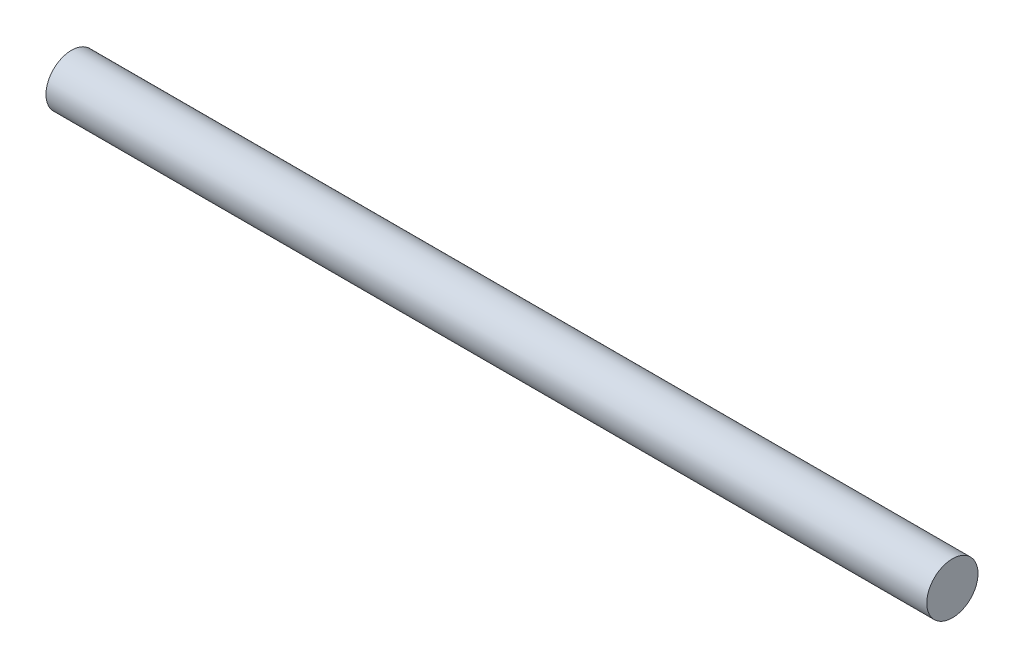
ISO-10303-21;
HEADER;
FILE_DESCRIPTION(('STEP AP214'),'2;1');
FILE_NAME('part.step','',(''),(''),'','','');
FILE_SCHEMA(('AUTOMOTIVE_DESIGN { 1 0 10303 214 1 1 1 1 }'));
ENDSEC;
DATA;
#1=APPLICATION_CONTEXT('core data for automotive mechanical design processes');
#2=APPLICATION_PROTOCOL_DEFINITION('international standard','automotive_design',2000,#1);
#3=PRODUCT_CONTEXT('',#1,'mechanical');
#4=PRODUCT('Part','Part','',(#3));
#5=PRODUCT_RELATED_PRODUCT_CATEGORY('part','',(#4));
#6=PRODUCT_DEFINITION_FORMATION('','',#4);
#7=PRODUCT_DEFINITION_CONTEXT('part definition',#1,'design');
#8=PRODUCT_DEFINITION('design','',#6,#7);
#9=PRODUCT_DEFINITION_SHAPE('','',#8);
#10=(LENGTH_UNIT() NAMED_UNIT(*) SI_UNIT(.MILLI.,.METRE.));
#11=(NAMED_UNIT(*) PLANE_ANGLE_UNIT() SI_UNIT($,.RADIAN.));
#12=(NAMED_UNIT(*) SI_UNIT($,.STERADIAN.) SOLID_ANGLE_UNIT());
#13=UNCERTAINTY_MEASURE_WITH_UNIT(LENGTH_MEASURE(1.E-05),#10,'distance_accuracy_value','');
#14=(GEOMETRIC_REPRESENTATION_CONTEXT(3) GLOBAL_UNCERTAINTY_ASSIGNED_CONTEXT((#13)) GLOBAL_UNIT_ASSIGNED_CONTEXT((#10,
#11,#12)) REPRESENTATION_CONTEXT('',''));
#15=CARTESIAN_POINT('',(0.,0.,0.));
#16=DIRECTION('',(0.,0.,1.));
#17=DIRECTION('',(1.,0.,0.));
#18=AXIS2_PLACEMENT_3D('',#15,#16,#17);
#19=CARTESIAN_POINT('',(86.,0.,0.));
#20=DIRECTION('',(-1.,0.,0.));
#21=DIRECTION('',(0.,0.,1.));
#22=AXIS2_PLACEMENT_3D('',#19,#20,#21);
#23=CYLINDRICAL_SURFACE('',#22,2.5);
#24=CARTESIAN_POINT('',(86.,0.,0.));
#25=DIRECTION('',(1.,0.,0.));
#26=DIRECTION('',(0.,0.,-1.));
#27=AXIS2_PLACEMENT_3D('',#24,#25,#26);
#28=CIRCLE('',#27,2.5);
#29=CARTESIAN_POINT('',(86.,0.,-2.5));
#30=VERTEX_POINT('',#29);
#31=EDGE_CURVE('E10',#30,#30,#28,.T.);
#32=ORIENTED_EDGE('',*,*,#31,.F.);
#33=EDGE_LOOP('',(#32));
#34=FACE_BOUND('',#33,.T.);
#35=CARTESIAN_POINT('',(0.,0.,0.));
#36=DIRECTION('',(1.,0.,0.));
#37=DIRECTION('',(0.,0.,-1.));
#38=AXIS2_PLACEMENT_3D('',#35,#36,#37);
#39=CIRCLE('',#38,2.5);
#40=CARTESIAN_POINT('',(0.,0.,-2.5));
#41=VERTEX_POINT('',#40);
#42=EDGE_CURVE('E33',#41,#41,#39,.T.);
#43=ORIENTED_EDGE('',*,*,#42,.T.);
#44=EDGE_LOOP('',(#43));
#45=FACE_BOUND('',#44,.T.);
#46=ADVANCED_FACE('F30',(#34,#45),#23,.T.);
#47=CARTESIAN_POINT('',(86.,0.,0.));
#48=DIRECTION('',(1.,0.,0.));
#49=DIRECTION('',(0.,0.,-1.));
#50=AXIS2_PLACEMENT_3D('',#47,#48,#49);
#51=PLANE('',#50);
#52=ORIENTED_EDGE('',*,*,#31,.T.);
#53=EDGE_LOOP('',(#52));
#54=FACE_BOUND('',#53,.T.);
#55=ADVANCED_FACE('F45',(#54),#51,.T.);
#56=CARTESIAN_POINT('',(0.,0.,0.));
#57=DIRECTION('',(1.,0.,0.));
#58=DIRECTION('',(0.,0.,-1.));
#59=AXIS2_PLACEMENT_3D('',#56,#57,#58);
#60=PLANE('',#59);
#61=ORIENTED_EDGE('',*,*,#42,.F.);
#62=EDGE_LOOP('',(#61));
#63=FACE_BOUND('',#62,.T.);
#64=ADVANCED_FACE('F43',(#63),#60,.F.);
#65=CLOSED_SHELL('',(#46,#55,#64));
#66=MANIFOLD_SOLID_BREP('B2',#65);
#67=ADVANCED_BREP_SHAPE_REPRESENTATION('',(#18,#66),#14);
#68=SHAPE_DEFINITION_REPRESENTATION(#9,#67);
ENDSEC;
END-ISO-10303-21;
